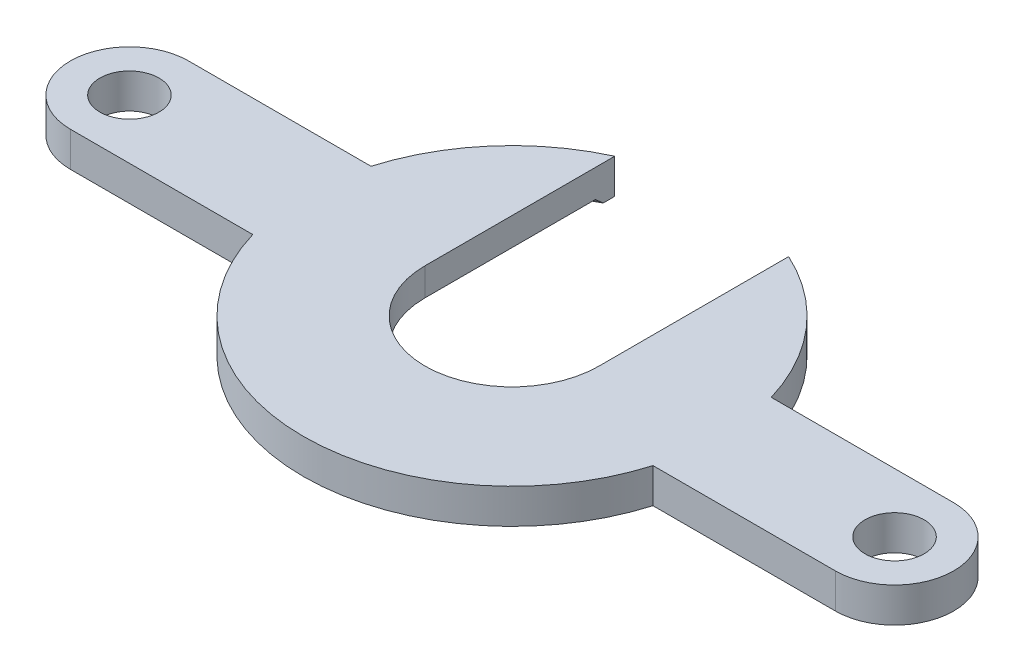
ISO-10303-21;
HEADER;
FILE_DESCRIPTION(('STEP AP214'),'2;1');
FILE_NAME('part.step','',(''),(''),'','','');
FILE_SCHEMA(('AUTOMOTIVE_DESIGN { 1 0 10303 214 1 1 1 1 }'));
ENDSEC;
DATA;
#1=APPLICATION_CONTEXT('core data for automotive mechanical design processes');
#2=APPLICATION_PROTOCOL_DEFINITION('international standard','automotive_design',2000,#1);
#3=PRODUCT_CONTEXT('',#1,'mechanical');
#4=PRODUCT('Part','Part','',(#3));
#5=PRODUCT_RELATED_PRODUCT_CATEGORY('part','',(#4));
#6=PRODUCT_DEFINITION_FORMATION('','',#4);
#7=PRODUCT_DEFINITION_CONTEXT('part definition',#1,'design');
#8=PRODUCT_DEFINITION('design','',#6,#7);
#9=PRODUCT_DEFINITION_SHAPE('','',#8);
#10=(LENGTH_UNIT() NAMED_UNIT(*) SI_UNIT(.MILLI.,.METRE.));
#11=(NAMED_UNIT(*) PLANE_ANGLE_UNIT() SI_UNIT($,.RADIAN.));
#12=(NAMED_UNIT(*) SI_UNIT($,.STERADIAN.) SOLID_ANGLE_UNIT());
#13=UNCERTAINTY_MEASURE_WITH_UNIT(LENGTH_MEASURE(1.E-05),#10,'distance_accuracy_value','');
#14=(GEOMETRIC_REPRESENTATION_CONTEXT(3) GLOBAL_UNCERTAINTY_ASSIGNED_CONTEXT((#13)) GLOBAL_UNIT_ASSIGNED_CONTEXT((#10,
#11,#12)) REPRESENTATION_CONTEXT('',''));
#15=CARTESIAN_POINT('',(0.,0.,0.));
#16=DIRECTION('',(0.,0.,1.));
#17=DIRECTION('',(1.,0.,0.));
#18=AXIS2_PLACEMENT_3D('',#15,#16,#17);
#19=CARTESIAN_POINT('',(12.5,5.,0.));
#20=DIRECTION('',(1.,0.,0.));
#21=DIRECTION('',(0.,0.,-1.));
#22=AXIS2_PLACEMENT_3D('',#19,#20,#21);
#23=PLANE('',#22);
#24=DIRECTION('',(0.,0.,1.));
#25=VECTOR('',#24,1.);
#26=CARTESIAN_POINT('',(12.5,0.,0.));
#27=LINE('',#26,#25);
#28=CARTESIAN_POINT('',(12.5,0.,-27.2717802865893));
#29=VERTEX_POINT('',#28);
#30=CARTESIAN_POINT('',(12.5,0.,-25.6124969497314));
#31=VERTEX_POINT('',#30);
#32=EDGE_CURVE('E152',#29,#31,#27,.T.);
#33=ORIENTED_EDGE('',*,*,#32,.T.);
#34=CARTESIAN_POINT('',(12.5,0.,-25.6124969497314));
#35=CARTESIAN_POINT('',(12.5,0.167078275455013,-25.4265986672724));
#36=CARTESIAN_POINT('',(12.5,0.333950744703593,-25.2405162345856));
#37=CARTESIAN_POINT('',(12.5,0.667284078054878,-24.8679830606351));
#38=CARTESIAN_POINT('',(12.5,0.833744942139636,-24.6815323193553));
#39=CARTESIAN_POINT('',(12.5,1.00000000000001,-24.4948974278318));
#40=B_SPLINE_CURVE_WITH_KNOTS('',3,(#34,#35,#36,#37,#38,#39),.UNSPECIFIED.,.F.,.F.,(4,2,4),(0.,
0.749838539106662,1.49967711090774),.UNSPECIFIED.);
#41=CARTESIAN_POINT('',(12.5,1.,-24.4948974278318));
#42=VERTEX_POINT('',#41);
#43=EDGE_CURVE('E54',#31,#42,#40,.T.);
#44=ORIENTED_EDGE('',*,*,#43,.T.);
#45=DIRECTION('',(0.,0.,1.));
#46=VECTOR('',#45,1.);
#47=CARTESIAN_POINT('',(12.5,1.,0.));
#48=LINE('',#47,#46);
#49=CARTESIAN_POINT('',(12.5,1.,0.));
#50=VERTEX_POINT('',#49);
#51=EDGE_CURVE('E148',#42,#50,#48,.T.);
#52=ORIENTED_EDGE('',*,*,#51,.T.);
#53=DIRECTION('',(0.,-1.,0.));
#54=VECTOR('',#53,1.);
#55=CARTESIAN_POINT('',(12.5,5.,0.));
#56=LINE('',#55,#54);
#57=CARTESIAN_POINT('',(12.5,5.,0.));
#58=VERTEX_POINT('',#57);
#59=EDGE_CURVE('E228',#58,#50,#56,.T.);
#60=ORIENTED_EDGE('',*,*,#59,.F.);
#61=DIRECTION('',(0.,0.,1.));
#62=VECTOR('',#61,1.);
#63=CARTESIAN_POINT('',(12.5,5.,0.));
#64=LINE('',#63,#62);
#65=CARTESIAN_POINT('',(12.5,5.,-27.2717802865893));
#66=VERTEX_POINT('',#65);
#67=EDGE_CURVE('E196',#66,#58,#64,.T.);
#68=ORIENTED_EDGE('',*,*,#67,.F.);
#69=DIRECTION('',(0.,-1.,0.));
#70=VECTOR('',#69,1.);
#71=CARTESIAN_POINT('',(12.5,5.,-27.2717802865893));
#72=LINE('',#71,#70);
#73=EDGE_CURVE('E230',#66,#29,#72,.T.);
#74=ORIENTED_EDGE('',*,*,#73,.T.);
#75=EDGE_LOOP('',(#33,#44,#52,#60,#68,#74));
#76=FACE_BOUND('',#75,.T.);
#77=ADVANCED_FACE('F39',(#76),#23,.F.);
#78=CARTESIAN_POINT('',(-12.5,5.,0.));
#79=DIRECTION('',(-1.,0.,0.));
#80=DIRECTION('',(0.,0.,1.));
#81=AXIS2_PLACEMENT_3D('',#78,#79,#80);
#82=PLANE('',#81);
#83=DIRECTION('',(0.,0.,-1.));
#84=VECTOR('',#83,1.);
#85=CARTESIAN_POINT('',(-12.5,1.,0.));
#86=LINE('',#85,#84);
#87=CARTESIAN_POINT('',(-12.5,1.,0.));
#88=VERTEX_POINT('',#87);
#89=CARTESIAN_POINT('',(-12.5,1.,-24.4948974278318));
#90=VERTEX_POINT('',#89);
#91=EDGE_CURVE('E256',#88,#90,#86,.T.);
#92=ORIENTED_EDGE('',*,*,#91,.T.);
#93=CARTESIAN_POINT('',(-12.5,1.00000000000001,-24.4948974278318));
#94=CARTESIAN_POINT('',(-12.5,0.833744942139636,-24.6815323193553));
#95=CARTESIAN_POINT('',(-12.5,0.667284078054879,-24.8679830606351));
#96=CARTESIAN_POINT('',(-12.5,0.333950744703593,-25.2405162345856));
#97=CARTESIAN_POINT('',(-12.5,0.167078275455013,-25.4265986672724));
#98=CARTESIAN_POINT('',(-12.5,0.,-25.6124969497314));
#99=B_SPLINE_CURVE_WITH_KNOTS('',3,(#93,#94,#95,#96,#97,#98),.UNSPECIFIED.,.F.,.F.,(4,2,4),(0.,
0.749838571801073,1.49967711090774),.UNSPECIFIED.);
#100=CARTESIAN_POINT('',(-12.5,0.,-25.6124969497314));
#101=VERTEX_POINT('',#100);
#102=EDGE_CURVE('E11',#90,#101,#99,.T.);
#103=ORIENTED_EDGE('',*,*,#102,.T.);
#104=DIRECTION('',(0.,0.,-1.));
#105=VECTOR('',#104,1.);
#106=CARTESIAN_POINT('',(-12.5,0.,0.));
#107=LINE('',#106,#105);
#108=CARTESIAN_POINT('',(-12.5,0.,-27.2717802865893));
#109=VERTEX_POINT('',#108);
#110=EDGE_CURVE('E180',#101,#109,#107,.T.);
#111=ORIENTED_EDGE('',*,*,#110,.T.);
#112=DIRECTION('',(0.,-1.,0.));
#113=VECTOR('',#112,1.);
#114=CARTESIAN_POINT('',(-12.5,5.,-27.2717802865893));
#115=LINE('',#114,#113);
#116=CARTESIAN_POINT('',(-12.5,5.,-27.2717802865893));
#117=VERTEX_POINT('',#116);
#118=EDGE_CURVE('E202',#117,#109,#115,.T.);
#119=ORIENTED_EDGE('',*,*,#118,.F.);
#120=DIRECTION('',(0.,0.,-1.));
#121=VECTOR('',#120,1.);
#122=CARTESIAN_POINT('',(-12.5,5.,0.));
#123=LINE('',#122,#121);
#124=CARTESIAN_POINT('',(-12.5,5.,0.));
#125=VERTEX_POINT('',#124);
#126=EDGE_CURVE('E200',#125,#117,#123,.T.);
#127=ORIENTED_EDGE('',*,*,#126,.F.);
#128=DIRECTION('',(0.,-1.,0.));
#129=VECTOR('',#128,1.);
#130=CARTESIAN_POINT('',(-12.5,5.,0.));
#131=LINE('',#130,#129);
#132=EDGE_CURVE('E225',#125,#88,#131,.T.);
#133=ORIENTED_EDGE('',*,*,#132,.T.);
#134=EDGE_LOOP('',(#92,#103,#111,#119,#127,#133));
#135=FACE_BOUND('',#134,.T.);
#136=ADVANCED_FACE('F267',(#135),#82,.F.);
#137=CARTESIAN_POINT('',(0.,5.,0.));
#138=DIRECTION('',(0.,1.,0.));
#139=DIRECTION('',(0.,0.,1.));
#140=AXIS2_PLACEMENT_3D('',#137,#138,#139);
#141=PLANE('',#140);
#142=CARTESIAN_POINT('',(-55.,5.,0.));
#143=DIRECTION('',(0.,1.,0.));
#144=DIRECTION('',(0.,0.,1.));
#145=AXIS2_PLACEMENT_3D('',#142,#143,#144);
#146=CIRCLE('',#145,4.25);
#147=CARTESIAN_POINT('',(-55.,5.,4.25));
#148=VERTEX_POINT('',#147);
#149=EDGE_CURVE('E170',#148,#148,#146,.T.);
#150=ORIENTED_EDGE('',*,*,#149,.F.);
#151=EDGE_LOOP('',(#150));
#152=FACE_BOUND('',#151,.T.);
#153=CARTESIAN_POINT('',(0.,5.,0.));
#154=DIRECTION('',(0.,1.,0.));
#155=DIRECTION('',(0.,0.,1.));
#156=AXIS2_PLACEMENT_3D('',#153,#154,#155);
#157=CIRCLE('',#156,30.);
#158=CARTESIAN_POINT('',(-28.7706447616316,5.,-8.50000000000004));
#159=VERTEX_POINT('',#158);
#160=EDGE_CURVE('E176',#117,#159,#157,.T.);
#161=ORIENTED_EDGE('',*,*,#160,.T.);
#162=DIRECTION('',(-1.,0.,0.));
#163=VECTOR('',#162,1.);
#164=CARTESIAN_POINT('',(-28.7706447616316,5.,-8.50000000000004));
#165=LINE('',#164,#163);
#166=CARTESIAN_POINT('',(-55.,5.,-8.50000000000001));
#167=VERTEX_POINT('',#166);
#168=EDGE_CURVE('E179',#159,#167,#165,.T.);
#169=ORIENTED_EDGE('',*,*,#168,.T.);
#170=CARTESIAN_POINT('',(-55.,5.,0.));
#171=DIRECTION('',(0.,1.,0.));
#172=DIRECTION('',(0.,0.,-1.));
#173=AXIS2_PLACEMENT_3D('',#170,#171,#172);
#174=CIRCLE('',#173,8.50000000000001);
#175=CARTESIAN_POINT('',(-55.,5.,8.50000000000001));
#176=VERTEX_POINT('',#175);
#177=EDGE_CURVE('E182',#167,#176,#174,.T.);
#178=ORIENTED_EDGE('',*,*,#177,.T.);
#179=DIRECTION('',(1.,0.,0.));
#180=VECTOR('',#179,1.);
#181=CARTESIAN_POINT('',(-28.7706447616316,5.,8.50000000000001));
#182=LINE('',#181,#180);
#183=CARTESIAN_POINT('',(-28.7706447616316,5.,8.50000000000001));
#184=VERTEX_POINT('',#183);
#185=EDGE_CURVE('E184',#176,#184,#182,.T.);
#186=ORIENTED_EDGE('',*,*,#185,.T.);
#187=CARTESIAN_POINT('',(0.,5.,0.));
#188=DIRECTION('',(0.,1.,0.));
#189=DIRECTION('',(0.,0.,1.));
#190=AXIS2_PLACEMENT_3D('',#187,#188,#189);
#191=CIRCLE('',#190,30.);
#192=CARTESIAN_POINT('',(28.7706447616316,5.,8.50000000000002));
#193=VERTEX_POINT('',#192);
#194=EDGE_CURVE('E186',#184,#193,#191,.T.);
#195=ORIENTED_EDGE('',*,*,#194,.T.);
#196=DIRECTION('',(1.,0.,0.));
#197=VECTOR('',#196,1.);
#198=CARTESIAN_POINT('',(55.,5.,8.49999999999999));
#199=LINE('',#198,#197);
#200=CARTESIAN_POINT('',(55.,5.,8.49999999999999));
#201=VERTEX_POINT('',#200);
#202=EDGE_CURVE('E188',#193,#201,#199,.T.);
#203=ORIENTED_EDGE('',*,*,#202,.T.);
#204=CARTESIAN_POINT('',(55.,5.,0.));
#205=DIRECTION('',(0.,1.,0.));
#206=DIRECTION('',(0.,0.,-1.));
#207=AXIS2_PLACEMENT_3D('',#204,#205,#206);
#208=CIRCLE('',#207,8.49999999999999);
#209=CARTESIAN_POINT('',(55.,5.,-8.50000000000002));
#210=VERTEX_POINT('',#209);
#211=EDGE_CURVE('E190',#201,#210,#208,.T.);
#212=ORIENTED_EDGE('',*,*,#211,.T.);
#213=DIRECTION('',(-1.,0.,0.));
#214=VECTOR('',#213,1.);
#215=CARTESIAN_POINT('',(55.,5.,-8.49999999999999));
#216=LINE('',#215,#214);
#217=CARTESIAN_POINT('',(28.7706447616316,5.,-8.50000000000004));
#218=VERTEX_POINT('',#217);
#219=EDGE_CURVE('E192',#210,#218,#216,.T.);
#220=ORIENTED_EDGE('',*,*,#219,.T.);
#221=CARTESIAN_POINT('',(0.,5.,0.));
#222=DIRECTION('',(0.,1.,0.));
#223=DIRECTION('',(0.,0.,1.));
#224=AXIS2_PLACEMENT_3D('',#221,#222,#223);
#225=CIRCLE('',#224,30.);
#226=EDGE_CURVE('E194',#218,#66,#225,.T.);
#227=ORIENTED_EDGE('',*,*,#226,.T.);
#228=ORIENTED_EDGE('',*,*,#67,.T.);
#229=CARTESIAN_POINT('',(0.,5.,0.));
#230=DIRECTION('',(0.,-1.,0.));
#231=DIRECTION('',(0.,0.,1.));
#232=AXIS2_PLACEMENT_3D('',#229,#230,#231);
#233=CIRCLE('',#232,12.5);
#234=EDGE_CURVE('E198',#58,#125,#233,.T.);
#235=ORIENTED_EDGE('',*,*,#234,.T.);
#236=ORIENTED_EDGE('',*,*,#126,.T.);
#237=EDGE_LOOP('',(#161,#169,#178,#186,#195,#203,#212,#220,#227,#228,#235,#236));
#238=FACE_BOUND('',#237,.T.);
#239=CARTESIAN_POINT('',(55.,5.,0.));
#240=DIRECTION('',(0.,1.,0.));
#241=DIRECTION('',(0.,0.,1.));
#242=AXIS2_PLACEMENT_3D('',#239,#240,#241);
#243=CIRCLE('',#242,4.25);
#244=CARTESIAN_POINT('',(55.,5.,4.24999999999998));
#245=VERTEX_POINT('',#244);
#246=EDGE_CURVE('E164',#245,#245,#243,.T.);
#247=ORIENTED_EDGE('',*,*,#246,.F.);
#248=EDGE_LOOP('',(#247));
#249=FACE_BOUND('',#248,.T.);
#250=ADVANCED_FACE('F307',(#152,#238,#249),#141,.T.);
#251=CARTESIAN_POINT('',(0.,0.,0.));
#252=DIRECTION('',(0.,1.,0.));
#253=DIRECTION('',(0.,0.,1.));
#254=AXIS2_PLACEMENT_3D('',#251,#252,#253);
#255=PLANE('',#254);
#256=ORIENTED_EDGE('',*,*,#110,.F.);
#257=CARTESIAN_POINT('',(0.,0.,0.));
#258=DIRECTION('',(0.,1.,0.));
#259=DIRECTION('',(0.,0.,1.));
#260=AXIS2_PLACEMENT_3D('',#257,#258,#259);
#261=CIRCLE('',#260,28.5);
#262=EDGE_CURVE('E153',#101,#31,#261,.T.);
#263=ORIENTED_EDGE('',*,*,#262,.T.);
#264=ORIENTED_EDGE('',*,*,#32,.F.);
#265=CARTESIAN_POINT('',(0.,0.,0.));
#266=DIRECTION('',(0.,1.,0.));
#267=DIRECTION('',(0.,0.,1.));
#268=AXIS2_PLACEMENT_3D('',#265,#266,#267);
#269=CIRCLE('',#268,30.);
#270=CARTESIAN_POINT('',(28.7706447616316,0.,-8.50000000000004));
#271=VERTEX_POINT('',#270);
#272=EDGE_CURVE('E219',#271,#29,#269,.T.);
#273=ORIENTED_EDGE('',*,*,#272,.F.);
#274=DIRECTION('',(-1.,0.,0.));
#275=VECTOR('',#274,1.);
#276=CARTESIAN_POINT('',(55.,0.,-8.49999999999999));
#277=LINE('',#276,#275);
#278=CARTESIAN_POINT('',(55.,0.,-8.50000000000002));
#279=VERTEX_POINT('',#278);
#280=EDGE_CURVE('E217',#279,#271,#277,.T.);
#281=ORIENTED_EDGE('',*,*,#280,.F.);
#282=CARTESIAN_POINT('',(55.,0.,0.));
#283=DIRECTION('',(0.,1.,0.));
#284=DIRECTION('',(0.,0.,-1.));
#285=AXIS2_PLACEMENT_3D('',#282,#283,#284);
#286=CIRCLE('',#285,8.49999999999999);
#287=CARTESIAN_POINT('',(55.,0.,8.49999999999999));
#288=VERTEX_POINT('',#287);
#289=EDGE_CURVE('E215',#288,#279,#286,.T.);
#290=ORIENTED_EDGE('',*,*,#289,.F.);
#291=DIRECTION('',(1.,0.,0.));
#292=VECTOR('',#291,1.);
#293=CARTESIAN_POINT('',(55.,0.,8.49999999999999));
#294=LINE('',#293,#292);
#295=CARTESIAN_POINT('',(28.7706447616316,0.,8.50000000000002));
#296=VERTEX_POINT('',#295);
#297=EDGE_CURVE('E213',#296,#288,#294,.T.);
#298=ORIENTED_EDGE('',*,*,#297,.F.);
#299=CARTESIAN_POINT('',(0.,0.,0.));
#300=DIRECTION('',(0.,1.,0.));
#301=DIRECTION('',(0.,0.,1.));
#302=AXIS2_PLACEMENT_3D('',#299,#300,#301);
#303=CIRCLE('',#302,30.);
#304=CARTESIAN_POINT('',(-28.7706447616316,0.,8.50000000000001));
#305=VERTEX_POINT('',#304);
#306=EDGE_CURVE('E211',#305,#296,#303,.T.);
#307=ORIENTED_EDGE('',*,*,#306,.F.);
#308=DIRECTION('',(1.,0.,0.));
#309=VECTOR('',#308,1.);
#310=CARTESIAN_POINT('',(-28.7706447616316,0.,8.50000000000001));
#311=LINE('',#310,#309);
#312=CARTESIAN_POINT('',(-55.,0.,8.50000000000001));
#313=VERTEX_POINT('',#312);
#314=EDGE_CURVE('E209',#313,#305,#311,.T.);
#315=ORIENTED_EDGE('',*,*,#314,.F.);
#316=CARTESIAN_POINT('',(-55.,0.,0.));
#317=DIRECTION('',(0.,1.,0.));
#318=DIRECTION('',(0.,0.,-1.));
#319=AXIS2_PLACEMENT_3D('',#316,#317,#318);
#320=CIRCLE('',#319,8.50000000000001);
#321=CARTESIAN_POINT('',(-55.,0.,-8.50000000000001));
#322=VERTEX_POINT('',#321);
#323=EDGE_CURVE('E207',#322,#313,#320,.T.);
#324=ORIENTED_EDGE('',*,*,#323,.F.);
#325=DIRECTION('',(-1.,0.,0.));
#326=VECTOR('',#325,1.);
#327=CARTESIAN_POINT('',(-28.7706447616316,0.,-8.50000000000004));
#328=LINE('',#327,#326);
#329=CARTESIAN_POINT('',(-28.7706447616316,0.,-8.50000000000004));
#330=VERTEX_POINT('',#329);
#331=EDGE_CURVE('E205',#330,#322,#328,.T.);
#332=ORIENTED_EDGE('',*,*,#331,.F.);
#333=CARTESIAN_POINT('',(0.,0.,0.));
#334=DIRECTION('',(0.,1.,0.));
#335=DIRECTION('',(0.,0.,1.));
#336=AXIS2_PLACEMENT_3D('',#333,#334,#335);
#337=CIRCLE('',#336,30.);
#338=EDGE_CURVE('E173',#109,#330,#337,.T.);
#339=ORIENTED_EDGE('',*,*,#338,.F.);
#340=EDGE_LOOP('',(#256,#263,#264,#273,#281,#290,#298,#307,#315,#324,#332,#339));
#341=FACE_BOUND('',#340,.T.);
#342=CARTESIAN_POINT('',(-55.,0.,0.));
#343=DIRECTION('',(0.,1.,0.));
#344=DIRECTION('',(0.,0.,1.));
#345=AXIS2_PLACEMENT_3D('',#342,#343,#344);
#346=CIRCLE('',#345,4.25);
#347=CARTESIAN_POINT('',(-55.,0.,4.25));
#348=VERTEX_POINT('',#347);
#349=EDGE_CURVE('E167',#348,#348,#346,.T.);
#350=ORIENTED_EDGE('',*,*,#349,.T.);
#351=EDGE_LOOP('',(#350));
#352=FACE_BOUND('',#351,.T.);
#353=CARTESIAN_POINT('',(55.,0.,0.));
#354=DIRECTION('',(0.,1.,0.));
#355=DIRECTION('',(0.,0.,1.));
#356=AXIS2_PLACEMENT_3D('',#353,#354,#355);
#357=CIRCLE('',#356,4.25);
#358=CARTESIAN_POINT('',(55.,0.,4.24999999999998));
#359=VERTEX_POINT('',#358);
#360=EDGE_CURVE('E159',#359,#359,#357,.T.);
#361=ORIENTED_EDGE('',*,*,#360,.T.);
#362=EDGE_LOOP('',(#361));
#363=FACE_BOUND('',#362,.T.);
#364=ADVANCED_FACE('F302',(#341,#352,#363),#255,.F.);
#365=CARTESIAN_POINT('',(0.,5.,0.));
#366=DIRECTION('',(0.,-1.,0.));
#367=DIRECTION('',(0.,0.,-1.));
#368=AXIS2_PLACEMENT_3D('',#365,#366,#367);
#369=CYLINDRICAL_SURFACE('',#368,30.);
#370=ORIENTED_EDGE('',*,*,#338,.T.);
#371=DIRECTION('',(0.,-1.,0.));
#372=VECTOR('',#371,1.);
#373=CARTESIAN_POINT('',(-28.7706447616316,5.,-8.50000000000004));
#374=LINE('',#373,#372);
#375=EDGE_CURVE('E253',#159,#330,#374,.T.);
#376=ORIENTED_EDGE('',*,*,#375,.F.);
#377=ORIENTED_EDGE('',*,*,#160,.F.);
#378=ORIENTED_EDGE('',*,*,#118,.T.);
#379=EDGE_LOOP('',(#370,#376,#377,#378));
#380=FACE_BOUND('',#379,.T.);
#381=ADVANCED_FACE('F299',(#380),#369,.T.);
#382=CARTESIAN_POINT('',(-28.7706447616316,5.,-8.50000000000004));
#383=DIRECTION('',(0.,0.,1.));
#384=DIRECTION('',(1.,0.,0.));
#385=AXIS2_PLACEMENT_3D('',#382,#383,#384);
#386=PLANE('',#385);
#387=ORIENTED_EDGE('',*,*,#331,.T.);
#388=DIRECTION('',(0.,-1.,0.));
#389=VECTOR('',#388,1.);
#390=CARTESIAN_POINT('',(-55.,5.,-8.50000000000001));
#391=LINE('',#390,#389);
#392=EDGE_CURVE('E250',#167,#322,#391,.T.);
#393=ORIENTED_EDGE('',*,*,#392,.F.);
#394=ORIENTED_EDGE('',*,*,#168,.F.);
#395=ORIENTED_EDGE('',*,*,#375,.T.);
#396=EDGE_LOOP('',(#387,#393,#394,#395));
#397=FACE_BOUND('',#396,.T.);
#398=ADVANCED_FACE('F296',(#397),#386,.F.);
#399=CARTESIAN_POINT('',(-55.,5.,0.));
#400=DIRECTION('',(0.,-1.,0.));
#401=DIRECTION('',(0.,0.,-1.));
#402=AXIS2_PLACEMENT_3D('',#399,#400,#401);
#403=CYLINDRICAL_SURFACE('',#402,8.50000000000001);
#404=ORIENTED_EDGE('',*,*,#323,.T.);
#405=DIRECTION('',(0.,-1.,0.));
#406=VECTOR('',#405,1.);
#407=CARTESIAN_POINT('',(-55.,5.,8.50000000000001));
#408=LINE('',#407,#406);
#409=EDGE_CURVE('E247',#176,#313,#408,.T.);
#410=ORIENTED_EDGE('',*,*,#409,.F.);
#411=ORIENTED_EDGE('',*,*,#177,.F.);
#412=ORIENTED_EDGE('',*,*,#392,.T.);
#413=EDGE_LOOP('',(#404,#410,#411,#412));
#414=FACE_BOUND('',#413,.T.);
#415=ADVANCED_FACE('F292',(#414),#403,.T.);
#416=CARTESIAN_POINT('',(-28.7706447616316,5.,8.50000000000001));
#417=DIRECTION('',(0.,0.,-1.));
#418=DIRECTION('',(-1.,0.,0.));
#419=AXIS2_PLACEMENT_3D('',#416,#417,#418);
#420=PLANE('',#419);
#421=ORIENTED_EDGE('',*,*,#314,.T.);
#422=DIRECTION('',(0.,-1.,0.));
#423=VECTOR('',#422,1.);
#424=CARTESIAN_POINT('',(-28.7706447616316,5.,8.50000000000001));
#425=LINE('',#424,#423);
#426=EDGE_CURVE('E244',#184,#305,#425,.T.);
#427=ORIENTED_EDGE('',*,*,#426,.F.);
#428=ORIENTED_EDGE('',*,*,#185,.F.);
#429=ORIENTED_EDGE('',*,*,#409,.T.);
#430=EDGE_LOOP('',(#421,#427,#428,#429));
#431=FACE_BOUND('',#430,.T.);
#432=ADVANCED_FACE('F288',(#431),#420,.F.);
#433=CARTESIAN_POINT('',(0.,5.,0.));
#434=DIRECTION('',(0.,-1.,0.));
#435=DIRECTION('',(0.,0.,-1.));
#436=AXIS2_PLACEMENT_3D('',#433,#434,#435);
#437=CYLINDRICAL_SURFACE('',#436,30.);
#438=ORIENTED_EDGE('',*,*,#306,.T.);
#439=DIRECTION('',(0.,-1.,0.));
#440=VECTOR('',#439,1.);
#441=CARTESIAN_POINT('',(28.7706447616316,5.,8.50000000000002));
#442=LINE('',#441,#440);
#443=EDGE_CURVE('E241',#193,#296,#442,.T.);
#444=ORIENTED_EDGE('',*,*,#443,.F.);
#445=ORIENTED_EDGE('',*,*,#194,.F.);
#446=ORIENTED_EDGE('',*,*,#426,.T.);
#447=EDGE_LOOP('',(#438,#444,#445,#446));
#448=FACE_BOUND('',#447,.T.);
#449=ADVANCED_FACE('F284',(#448),#437,.T.);
#450=CARTESIAN_POINT('',(55.,5.,8.49999999999999));
#451=DIRECTION('',(0.,0.,-1.));
#452=DIRECTION('',(-1.,0.,0.));
#453=AXIS2_PLACEMENT_3D('',#450,#451,#452);
#454=PLANE('',#453);
#455=ORIENTED_EDGE('',*,*,#297,.T.);
#456=DIRECTION('',(0.,-1.,0.));
#457=VECTOR('',#456,1.);
#458=CARTESIAN_POINT('',(55.,5.,8.49999999999999));
#459=LINE('',#458,#457);
#460=EDGE_CURVE('E238',#201,#288,#459,.T.);
#461=ORIENTED_EDGE('',*,*,#460,.F.);
#462=ORIENTED_EDGE('',*,*,#202,.F.);
#463=ORIENTED_EDGE('',*,*,#443,.T.);
#464=EDGE_LOOP('',(#455,#461,#462,#463));
#465=FACE_BOUND('',#464,.T.);
#466=ADVANCED_FACE('F280',(#465),#454,.F.);
#467=CARTESIAN_POINT('',(55.,5.,0.));
#468=DIRECTION('',(0.,-1.,0.));
#469=DIRECTION('',(0.,0.,-1.));
#470=AXIS2_PLACEMENT_3D('',#467,#468,#469);
#471=CYLINDRICAL_SURFACE('',#470,8.49999999999999);
#472=ORIENTED_EDGE('',*,*,#289,.T.);
#473=DIRECTION('',(0.,-1.,0.));
#474=VECTOR('',#473,1.);
#475=CARTESIAN_POINT('',(55.,5.,-8.50000000000002));
#476=LINE('',#475,#474);
#477=EDGE_CURVE('E235',#210,#279,#476,.T.);
#478=ORIENTED_EDGE('',*,*,#477,.F.);
#479=ORIENTED_EDGE('',*,*,#211,.F.);
#480=ORIENTED_EDGE('',*,*,#460,.T.);
#481=EDGE_LOOP('',(#472,#478,#479,#480));
#482=FACE_BOUND('',#481,.T.);
#483=ADVANCED_FACE('F276',(#482),#471,.T.);
#484=CARTESIAN_POINT('',(55.,5.,-8.49999999999999));
#485=DIRECTION('',(0.,0.,1.));
#486=DIRECTION('',(1.,0.,0.));
#487=AXIS2_PLACEMENT_3D('',#484,#485,#486);
#488=PLANE('',#487);
#489=ORIENTED_EDGE('',*,*,#280,.T.);
#490=DIRECTION('',(0.,-1.,0.));
#491=VECTOR('',#490,1.);
#492=CARTESIAN_POINT('',(28.7706447616316,5.,-8.50000000000004));
#493=LINE('',#492,#491);
#494=EDGE_CURVE('E232',#218,#271,#493,.T.);
#495=ORIENTED_EDGE('',*,*,#494,.F.);
#496=ORIENTED_EDGE('',*,*,#219,.F.);
#497=ORIENTED_EDGE('',*,*,#477,.T.);
#498=EDGE_LOOP('',(#489,#495,#496,#497));
#499=FACE_BOUND('',#498,.T.);
#500=ADVANCED_FACE('F272',(#499),#488,.F.);
#501=CARTESIAN_POINT('',(0.,5.,0.));
#502=DIRECTION('',(0.,-1.,0.));
#503=DIRECTION('',(0.,0.,-1.));
#504=AXIS2_PLACEMENT_3D('',#501,#502,#503);
#505=CYLINDRICAL_SURFACE('',#504,30.);
#506=ORIENTED_EDGE('',*,*,#272,.T.);
#507=ORIENTED_EDGE('',*,*,#73,.F.);
#508=ORIENTED_EDGE('',*,*,#226,.F.);
#509=ORIENTED_EDGE('',*,*,#494,.T.);
#510=EDGE_LOOP('',(#506,#507,#508,#509));
#511=FACE_BOUND('',#510,.T.);
#512=ADVANCED_FACE('F269',(#511),#505,.T.);
#513=CARTESIAN_POINT('',(0.,5.,0.));
#514=DIRECTION('',(0.,-1.,0.));
#515=DIRECTION('',(0.,0.,-1.));
#516=AXIS2_PLACEMENT_3D('',#513,#514,#515);
#517=CYLINDRICAL_SURFACE('',#516,12.5);
#518=ORIENTED_EDGE('',*,*,#59,.T.);
#519=CARTESIAN_POINT('',(0.,1.,0.));
#520=DIRECTION('',(0.,1.,0.));
#521=DIRECTION('',(0.,0.,1.));
#522=AXIS2_PLACEMENT_3D('',#519,#520,#521);
#523=CIRCLE('',#522,12.5);
#524=EDGE_CURVE('E158',#50,#88,#523,.F.);
#525=ORIENTED_EDGE('',*,*,#524,.T.);
#526=ORIENTED_EDGE('',*,*,#132,.F.);
#527=ORIENTED_EDGE('',*,*,#234,.F.);
#528=EDGE_LOOP('',(#518,#525,#526,#527));
#529=FACE_BOUND('',#528,.T.);
#530=ADVANCED_FACE('F268',(#529),#517,.F.);
#531=CARTESIAN_POINT('',(-55.,5.,0.));
#532=DIRECTION('',(0.,-1.,0.));
#533=DIRECTION('',(0.,0.,-1.));
#534=AXIS2_PLACEMENT_3D('',#531,#532,#533);
#535=CYLINDRICAL_SURFACE('',#534,4.25);
#536=ORIENTED_EDGE('',*,*,#149,.T.);
#537=EDGE_LOOP('',(#536));
#538=FACE_BOUND('',#537,.T.);
#539=ORIENTED_EDGE('',*,*,#349,.F.);
#540=EDGE_LOOP('',(#539));
#541=FACE_BOUND('',#540,.T.);
#542=ADVANCED_FACE('F332',(#538,#541),#535,.F.);
#543=CARTESIAN_POINT('',(55.,5.,0.));
#544=DIRECTION('',(0.,-1.,0.));
#545=DIRECTION('',(0.,0.,-1.));
#546=AXIS2_PLACEMENT_3D('',#543,#544,#545);
#547=CYLINDRICAL_SURFACE('',#546,4.25);
#548=ORIENTED_EDGE('',*,*,#246,.T.);
#549=EDGE_LOOP('',(#548));
#550=FACE_BOUND('',#549,.T.);
#551=ORIENTED_EDGE('',*,*,#360,.F.);
#552=EDGE_LOOP('',(#551));
#553=FACE_BOUND('',#552,.T.);
#554=ADVANCED_FACE('F335',(#550,#553),#547,.F.);
#555=CARTESIAN_POINT('',(0.,1.,0.));
#556=DIRECTION('',(0.,1.,0.));
#557=DIRECTION('',(0.,0.,1.));
#558=AXIS2_PLACEMENT_3D('',#555,#556,#557);
#559=PLANE('',#558);
#560=CARTESIAN_POINT('',(0.,1.,0.));
#561=DIRECTION('',(0.,1.,0.));
#562=DIRECTION('',(0.,0.,1.));
#563=AXIS2_PLACEMENT_3D('',#560,#561,#562);
#564=CIRCLE('',#563,27.5);
#565=EDGE_CURVE('E156',#90,#42,#564,.T.);
#566=ORIENTED_EDGE('',*,*,#565,.F.);
#567=ORIENTED_EDGE('',*,*,#91,.F.);
#568=ORIENTED_EDGE('',*,*,#524,.F.);
#569=ORIENTED_EDGE('',*,*,#51,.F.);
#570=EDGE_LOOP('',(#566,#567,#568,#569));
#571=FACE_BOUND('',#570,.T.);
#572=ADVANCED_FACE('F155',(#571),#559,.F.);
#573=CARTESIAN_POINT('',(0.,0.,0.));
#574=DIRECTION('',(0.,-1.,0.));
#575=DIRECTION('',(0.,0.,-1.));
#576=AXIS2_PLACEMENT_3D('',#573,#574,#575);
#577=CONICAL_SURFACE('',#576,28.5,0.785398163397447);
#578=ORIENTED_EDGE('',*,*,#102,.F.);
#579=ORIENTED_EDGE('',*,*,#565,.T.);
#580=ORIENTED_EDGE('',*,*,#43,.F.);
#581=ORIENTED_EDGE('',*,*,#262,.F.);
#582=EDGE_LOOP('',(#578,#579,#580,#581));
#583=FACE_BOUND('',#582,.T.);
#584=ADVANCED_FACE('F42',(#583),#577,.F.);
#585=CLOSED_SHELL('',(#77,#136,#250,#364,#381,#398,#415,#432,#449,#466,#483,#500,#512,#530,#542,
#554,#572,#584));
#586=MANIFOLD_SOLID_BREP('B2',#585);
#587=ADVANCED_BREP_SHAPE_REPRESENTATION('',(#18,#586),#14);
#588=SHAPE_DEFINITION_REPRESENTATION(#9,#587);
ENDSEC;
END-ISO-10303-21;
